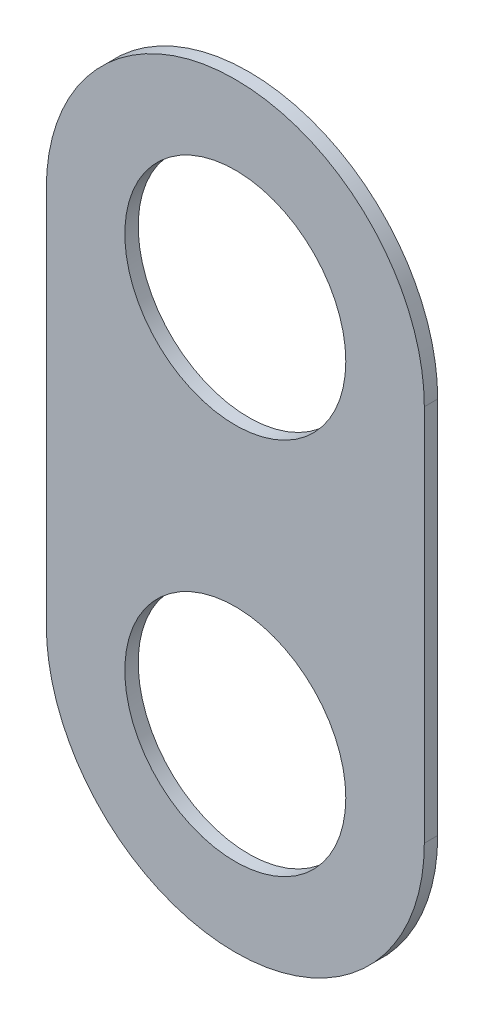
ISO-10303-21;
HEADER;
FILE_DESCRIPTION(('STEP AP214'),'2;1');
FILE_NAME('part.step','',(''),(''),'','','');
FILE_SCHEMA(('AUTOMOTIVE_DESIGN { 1 0 10303 214 1 1 1 1 }'));
ENDSEC;
DATA;
#1=APPLICATION_CONTEXT('core data for automotive mechanical design processes');
#2=APPLICATION_PROTOCOL_DEFINITION('international standard','automotive_design',2000,#1);
#3=PRODUCT_CONTEXT('',#1,'mechanical');
#4=PRODUCT('Part','Part','',(#3));
#5=PRODUCT_RELATED_PRODUCT_CATEGORY('part','',(#4));
#6=PRODUCT_DEFINITION_FORMATION('','',#4);
#7=PRODUCT_DEFINITION_CONTEXT('part definition',#1,'design');
#8=PRODUCT_DEFINITION('design','',#6,#7);
#9=PRODUCT_DEFINITION_SHAPE('','',#8);
#10=(LENGTH_UNIT() NAMED_UNIT(*) SI_UNIT(.MILLI.,.METRE.));
#11=(NAMED_UNIT(*) PLANE_ANGLE_UNIT() SI_UNIT($,.RADIAN.));
#12=(NAMED_UNIT(*) SI_UNIT($,.STERADIAN.) SOLID_ANGLE_UNIT());
#13=UNCERTAINTY_MEASURE_WITH_UNIT(LENGTH_MEASURE(1.E-05),#10,'distance_accuracy_value','');
#14=(GEOMETRIC_REPRESENTATION_CONTEXT(3) GLOBAL_UNCERTAINTY_ASSIGNED_CONTEXT((#13)) GLOBAL_UNIT_ASSIGNED_CONTEXT((#10,
#11,#12)) REPRESENTATION_CONTEXT('',''));
#15=CARTESIAN_POINT('',(0.,0.,0.));
#16=DIRECTION('',(0.,0.,1.));
#17=DIRECTION('',(1.,0.,0.));
#18=AXIS2_PLACEMENT_3D('',#15,#16,#17);
#19=CARTESIAN_POINT('',(19.05,24.7986501429514,1.34885860094992));
#20=DIRECTION('',(0.,0.,1.));
#21=DIRECTION('',(1.,0.,0.));
#22=AXIS2_PLACEMENT_3D('',#19,#20,#21);
#23=PLANE('',#22);
#24=CARTESIAN_POINT('',(19.05,24.7986501429514,1.34885860094992));
#25=DIRECTION('',(0.,0.,1.));
#26=DIRECTION('',(1.,0.,0.));
#27=AXIS2_PLACEMENT_3D('',#24,#25,#26);
#28=CIRCLE('',#27,11.13536);
#29=CARTESIAN_POINT('',(30.18536,24.7986501429514,1.34885860094992));
#30=VERTEX_POINT('',#29);
#31=EDGE_CURVE('E116',#30,#30,#28,.T.);
#32=ORIENTED_EDGE('',*,*,#31,.F.);
#33=EDGE_LOOP('',(#32));
#34=FACE_BOUND('',#33,.T.);
#35=CARTESIAN_POINT('',(19.05,24.7986501429514,1.34885860094992));
#36=DIRECTION('',(0.,0.,1.));
#37=DIRECTION('',(1.,0.,0.));
#38=AXIS2_PLACEMENT_3D('',#35,#36,#37);
#39=CIRCLE('',#38,19.05);
#40=CARTESIAN_POINT('',(38.1,24.7986501429514,1.34885860094992));
#41=VERTEX_POINT('',#40);
#42=CARTESIAN_POINT('',(0.,24.7986501429514,1.34885860094992));
#43=VERTEX_POINT('',#42);
#44=EDGE_CURVE('E101',#41,#43,#39,.T.);
#45=ORIENTED_EDGE('',*,*,#44,.T.);
#46=DIRECTION('',(0.,-1.,0.));
#47=VECTOR('',#46,1.);
#48=CARTESIAN_POINT('',(0.,24.7986501429514,1.34885860094992));
#49=LINE('',#48,#47);
#50=CARTESIAN_POINT('',(0.,-13.3013498570486,1.34885860094992));
#51=VERTEX_POINT('',#50);
#52=EDGE_CURVE('E96',#43,#51,#49,.T.);
#53=ORIENTED_EDGE('',*,*,#52,.T.);
#54=CARTESIAN_POINT('',(19.05,-13.3013498570486,1.34885860094992));
#55=DIRECTION('',(0.,0.,1.));
#56=DIRECTION('',(1.,0.,0.));
#57=AXIS2_PLACEMENT_3D('',#54,#55,#56);
#58=CIRCLE('',#57,19.05);
#59=CARTESIAN_POINT('',(38.1,-13.3013498570486,1.34885860094992));
#60=VERTEX_POINT('',#59);
#61=EDGE_CURVE('E99',#51,#60,#58,.T.);
#62=ORIENTED_EDGE('',*,*,#61,.T.);
#63=DIRECTION('',(0.,1.,0.));
#64=VECTOR('',#63,1.);
#65=CARTESIAN_POINT('',(38.1,24.7986501429514,1.34885860094992));
#66=LINE('',#65,#64);
#67=EDGE_CURVE('E66',#60,#41,#66,.T.);
#68=ORIENTED_EDGE('',*,*,#67,.T.);
#69=EDGE_LOOP('',(#45,#53,#62,#68));
#70=FACE_BOUND('',#69,.T.);
#71=CARTESIAN_POINT('',(19.05,-13.3013498570486,1.34885860094992));
#72=DIRECTION('',(0.,0.,1.));
#73=DIRECTION('',(1.,0.,0.));
#74=AXIS2_PLACEMENT_3D('',#71,#72,#73);
#75=CIRCLE('',#74,11.13536);
#76=CARTESIAN_POINT('',(30.18536,-13.3013498570486,1.34885860094992));
#77=VERTEX_POINT('',#76);
#78=EDGE_CURVE('E131',#77,#77,#75,.T.);
#79=ORIENTED_EDGE('',*,*,#78,.F.);
#80=EDGE_LOOP('',(#79));
#81=FACE_BOUND('',#80,.T.);
#82=ADVANCED_FACE('F49',(#34,#70,#81),#23,.T.);
#83=CARTESIAN_POINT('',(19.05,24.7986501429514,0.));
#84=DIRECTION('',(0.,0.,1.));
#85=DIRECTION('',(1.,0.,0.));
#86=AXIS2_PLACEMENT_3D('',#83,#84,#85);
#87=PLANE('',#86);
#88=CARTESIAN_POINT('',(19.05,24.7986501429514,0.));
#89=DIRECTION('',(0.,0.,1.));
#90=DIRECTION('',(1.,0.,0.));
#91=AXIS2_PLACEMENT_3D('',#88,#89,#90);
#92=CIRCLE('',#91,19.05);
#93=CARTESIAN_POINT('',(38.1,24.7986501429514,0.));
#94=VERTEX_POINT('',#93);
#95=CARTESIAN_POINT('',(0.,24.7986501429514,0.));
#96=VERTEX_POINT('',#95);
#97=EDGE_CURVE('E113',#94,#96,#92,.T.);
#98=ORIENTED_EDGE('',*,*,#97,.F.);
#99=DIRECTION('',(0.,1.,0.));
#100=VECTOR('',#99,1.);
#101=CARTESIAN_POINT('',(38.1,24.7986501429514,0.));
#102=LINE('',#101,#100);
#103=CARTESIAN_POINT('',(38.1,-13.3013498570486,0.));
#104=VERTEX_POINT('',#103);
#105=EDGE_CURVE('E89',#104,#94,#102,.T.);
#106=ORIENTED_EDGE('',*,*,#105,.F.);
#107=CARTESIAN_POINT('',(19.05,-13.3013498570486,0.));
#108=DIRECTION('',(0.,0.,1.));
#109=DIRECTION('',(1.,0.,0.));
#110=AXIS2_PLACEMENT_3D('',#107,#108,#109);
#111=CIRCLE('',#110,19.05);
#112=CARTESIAN_POINT('',(0.,-13.3013498570486,0.));
#113=VERTEX_POINT('',#112);
#114=EDGE_CURVE('E83',#113,#104,#111,.T.);
#115=ORIENTED_EDGE('',*,*,#114,.F.);
#116=DIRECTION('',(0.,-1.,0.));
#117=VECTOR('',#116,1.);
#118=CARTESIAN_POINT('',(0.,24.7986501429514,0.));
#119=LINE('',#118,#117);
#120=EDGE_CURVE('E105',#96,#113,#119,.T.);
#121=ORIENTED_EDGE('',*,*,#120,.F.);
#122=EDGE_LOOP('',(#98,#106,#115,#121));
#123=FACE_BOUND('',#122,.T.);
#124=CARTESIAN_POINT('',(19.05,24.7986501429514,0.));
#125=DIRECTION('',(0.,0.,1.));
#126=DIRECTION('',(1.,0.,0.));
#127=AXIS2_PLACEMENT_3D('',#124,#125,#126);
#128=CIRCLE('',#127,11.13536);
#129=CARTESIAN_POINT('',(30.18536,24.7986501429514,0.));
#130=VERTEX_POINT('',#129);
#131=EDGE_CURVE('E128',#130,#130,#128,.T.);
#132=ORIENTED_EDGE('',*,*,#131,.T.);
#133=EDGE_LOOP('',(#132));
#134=FACE_BOUND('',#133,.T.);
#135=CARTESIAN_POINT('',(19.05,-13.3013498570486,0.));
#136=DIRECTION('',(0.,0.,1.));
#137=DIRECTION('',(1.,0.,0.));
#138=AXIS2_PLACEMENT_3D('',#135,#136,#137);
#139=CIRCLE('',#138,11.13536);
#140=CARTESIAN_POINT('',(30.18536,-13.3013498570486,0.));
#141=VERTEX_POINT('',#140);
#142=EDGE_CURVE('E134',#141,#141,#139,.T.);
#143=ORIENTED_EDGE('',*,*,#142,.T.);
#144=EDGE_LOOP('',(#143));
#145=FACE_BOUND('',#144,.T.);
#146=ADVANCED_FACE('F124',(#123,#134,#145),#87,.F.);
#147=CARTESIAN_POINT('',(19.05,24.7986501429514,1.34885860094992));
#148=DIRECTION('',(0.,0.,-1.));
#149=DIRECTION('',(-1.,0.,0.));
#150=AXIS2_PLACEMENT_3D('',#147,#148,#149);
#151=CYLINDRICAL_SURFACE('',#150,19.05);
#152=ORIENTED_EDGE('',*,*,#97,.T.);
#153=DIRECTION('',(0.,0.,-1.));
#154=VECTOR('',#153,1.);
#155=CARTESIAN_POINT('',(0.,24.7986501429514,1.34885860094992));
#156=LINE('',#155,#154);
#157=EDGE_CURVE('E11',#43,#96,#156,.T.);
#158=ORIENTED_EDGE('',*,*,#157,.F.);
#159=ORIENTED_EDGE('',*,*,#44,.F.);
#160=DIRECTION('',(0.,0.,-1.));
#161=VECTOR('',#160,1.);
#162=CARTESIAN_POINT('',(38.1,24.7986501429514,1.34885860094992));
#163=LINE('',#162,#161);
#164=EDGE_CURVE('E109',#41,#94,#163,.T.);
#165=ORIENTED_EDGE('',*,*,#164,.T.);
#166=EDGE_LOOP('',(#152,#158,#159,#165));
#167=FACE_BOUND('',#166,.T.);
#168=ADVANCED_FACE('F51',(#167),#151,.T.);
#169=CARTESIAN_POINT('',(0.,24.7986501429514,1.34885860094992));
#170=DIRECTION('',(1.,0.,0.));
#171=DIRECTION('',(0.,1.,0.));
#172=AXIS2_PLACEMENT_3D('',#169,#170,#171);
#173=PLANE('',#172);
#174=ORIENTED_EDGE('',*,*,#120,.T.);
#175=DIRECTION('',(0.,0.,-1.));
#176=VECTOR('',#175,1.);
#177=CARTESIAN_POINT('',(0.,-13.3013498570486,1.34885860094992));
#178=LINE('',#177,#176);
#179=EDGE_CURVE('E58',#51,#113,#178,.T.);
#180=ORIENTED_EDGE('',*,*,#179,.F.);
#181=ORIENTED_EDGE('',*,*,#52,.F.);
#182=ORIENTED_EDGE('',*,*,#157,.T.);
#183=EDGE_LOOP('',(#174,#180,#181,#182));
#184=FACE_BOUND('',#183,.T.);
#185=ADVANCED_FACE('F104',(#184),#173,.F.);
#186=CARTESIAN_POINT('',(19.05,-13.3013498570486,1.34885860094992));
#187=DIRECTION('',(0.,0.,-1.));
#188=DIRECTION('',(-1.,0.,0.));
#189=AXIS2_PLACEMENT_3D('',#186,#187,#188);
#190=CYLINDRICAL_SURFACE('',#189,19.05);
#191=ORIENTED_EDGE('',*,*,#114,.T.);
#192=DIRECTION('',(0.,0.,-1.));
#193=VECTOR('',#192,1.);
#194=CARTESIAN_POINT('',(38.1,-13.3013498570486,1.34885860094992));
#195=LINE('',#194,#193);
#196=EDGE_CURVE('E106',#60,#104,#195,.T.);
#197=ORIENTED_EDGE('',*,*,#196,.F.);
#198=ORIENTED_EDGE('',*,*,#61,.F.);
#199=ORIENTED_EDGE('',*,*,#179,.T.);
#200=EDGE_LOOP('',(#191,#197,#198,#199));
#201=FACE_BOUND('',#200,.T.);
#202=ADVANCED_FACE('F107',(#201),#190,.T.);
#203=CARTESIAN_POINT('',(38.1,24.7986501429514,1.34885860094992));
#204=DIRECTION('',(-1.,0.,0.));
#205=DIRECTION('',(0.,0.,1.));
#206=AXIS2_PLACEMENT_3D('',#203,#204,#205);
#207=PLANE('',#206);
#208=ORIENTED_EDGE('',*,*,#105,.T.);
#209=ORIENTED_EDGE('',*,*,#164,.F.);
#210=ORIENTED_EDGE('',*,*,#67,.F.);
#211=ORIENTED_EDGE('',*,*,#196,.T.);
#212=EDGE_LOOP('',(#208,#209,#210,#211));
#213=FACE_BOUND('',#212,.T.);
#214=ADVANCED_FACE('F121',(#213),#207,.F.);
#215=CARTESIAN_POINT('',(19.05,24.7986501429514,1.34885860094992));
#216=DIRECTION('',(0.,0.,-1.));
#217=DIRECTION('',(-1.,0.,0.));
#218=AXIS2_PLACEMENT_3D('',#215,#216,#217);
#219=CYLINDRICAL_SURFACE('',#218,11.13536);
#220=ORIENTED_EDGE('',*,*,#31,.T.);
#221=EDGE_LOOP('',(#220));
#222=FACE_BOUND('',#221,.T.);
#223=ORIENTED_EDGE('',*,*,#131,.F.);
#224=EDGE_LOOP('',(#223));
#225=FACE_BOUND('',#224,.T.);
#226=ADVANCED_FACE('F151',(#222,#225),#219,.F.);
#227=CARTESIAN_POINT('',(19.05,-13.3013498570486,1.34885860094992));
#228=DIRECTION('',(0.,0.,-1.));
#229=DIRECTION('',(-1.,0.,0.));
#230=AXIS2_PLACEMENT_3D('',#227,#228,#229);
#231=CYLINDRICAL_SURFACE('',#230,11.13536);
#232=ORIENTED_EDGE('',*,*,#78,.T.);
#233=EDGE_LOOP('',(#232));
#234=FACE_BOUND('',#233,.T.);
#235=ORIENTED_EDGE('',*,*,#142,.F.);
#236=EDGE_LOOP('',(#235));
#237=FACE_BOUND('',#236,.T.);
#238=ADVANCED_FACE('F140',(#234,#237),#231,.F.);
#239=CLOSED_SHELL('',(#82,#146,#168,#185,#202,#214,#226,#238));
#240=MANIFOLD_SOLID_BREP('B2',#239);
#241=ADVANCED_BREP_SHAPE_REPRESENTATION('',(#18,#240),#14);
#242=SHAPE_DEFINITION_REPRESENTATION(#9,#241);
ENDSEC;
END-ISO-10303-21;
